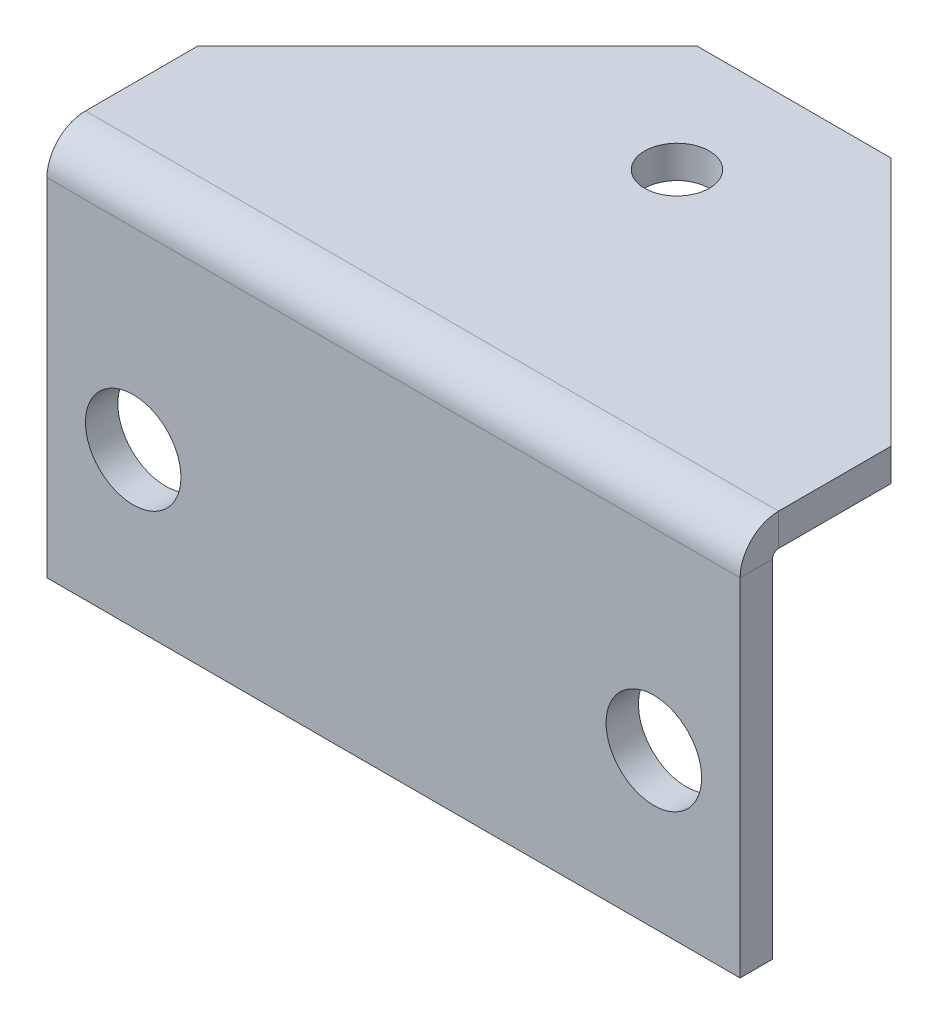
ISO-10303-21;
HEADER;
FILE_DESCRIPTION(('STEP AP214'),'2;1');
FILE_NAME('part.step','',(''),(''),'','','');
FILE_SCHEMA(('AUTOMOTIVE_DESIGN { 1 0 10303 214 1 1 1 1 }'));
ENDSEC;
DATA;
#1=APPLICATION_CONTEXT('core data for automotive mechanical design processes');
#2=APPLICATION_PROTOCOL_DEFINITION('international standard','automotive_design',2000,#1);
#3=PRODUCT_CONTEXT('',#1,'mechanical');
#4=PRODUCT('Part','Part','',(#3));
#5=PRODUCT_RELATED_PRODUCT_CATEGORY('part','',(#4));
#6=PRODUCT_DEFINITION_FORMATION('','',#4);
#7=PRODUCT_DEFINITION_CONTEXT('part definition',#1,'design');
#8=PRODUCT_DEFINITION('design','',#6,#7);
#9=PRODUCT_DEFINITION_SHAPE('','',#8);
#10=(LENGTH_UNIT() NAMED_UNIT(*) SI_UNIT(.MILLI.,.METRE.));
#11=(NAMED_UNIT(*) PLANE_ANGLE_UNIT() SI_UNIT($,.RADIAN.));
#12=(NAMED_UNIT(*) SI_UNIT($,.STERADIAN.) SOLID_ANGLE_UNIT());
#13=UNCERTAINTY_MEASURE_WITH_UNIT(LENGTH_MEASURE(1.E-05),#10,'distance_accuracy_value','');
#14=(GEOMETRIC_REPRESENTATION_CONTEXT(3) GLOBAL_UNCERTAINTY_ASSIGNED_CONTEXT((#13)) GLOBAL_UNIT_ASSIGNED_CONTEXT((#10,
#11,#12)) REPRESENTATION_CONTEXT('',''));
#15=CARTESIAN_POINT('',(0.,0.,0.));
#16=DIRECTION('',(0.,0.,1.));
#17=DIRECTION('',(1.,0.,0.));
#18=AXIS2_PLACEMENT_3D('',#15,#16,#17);
#19=CARTESIAN_POINT('',(28.575,15.875,-2.667));
#20=DIRECTION('',(1.,0.,0.));
#21=DIRECTION('',(0.,0.,-1.));
#22=AXIS2_PLACEMENT_3D('',#19,#20,#21);
#23=PLANE('',#22);
#24=DIRECTION('',(0.,1.,0.));
#25=VECTOR('',#24,1.);
#26=CARTESIAN_POINT('',(28.575,15.875,-2.667));
#27=LINE('',#26,#25);
#28=CARTESIAN_POINT('',(28.575,-15.875,-2.667));
#29=VERTEX_POINT('',#28);
#30=CARTESIAN_POINT('',(28.575,12.7,-2.667));
#31=VERTEX_POINT('',#30);
#32=EDGE_CURVE('E231',#29,#31,#27,.T.);
#33=ORIENTED_EDGE('',*,*,#32,.T.);
#34=DIRECTION('',(0.,0.,1.));
#35=VECTOR('',#34,1.);
#36=CARTESIAN_POINT('',(28.575,12.7,-2.667));
#37=LINE('',#36,#35);
#38=CARTESIAN_POINT('',(28.575,12.7,0.));
#39=VERTEX_POINT('',#38);
#40=EDGE_CURVE('E208',#31,#39,#37,.T.);
#41=ORIENTED_EDGE('',*,*,#40,.T.);
#42=DIRECTION('',(0.,1.,0.));
#43=VECTOR('',#42,1.);
#44=CARTESIAN_POINT('',(28.575,15.875,0.));
#45=LINE('',#44,#43);
#46=CARTESIAN_POINT('',(28.575,-15.875,0.));
#47=VERTEX_POINT('',#46);
#48=EDGE_CURVE('E227',#47,#39,#45,.T.);
#49=ORIENTED_EDGE('',*,*,#48,.F.);
#50=DIRECTION('',(0.,0.,1.));
#51=VECTOR('',#50,1.);
#52=CARTESIAN_POINT('',(28.575,-15.875,-2.667));
#53=LINE('',#52,#51);
#54=EDGE_CURVE('E253',#29,#47,#53,.T.);
#55=ORIENTED_EDGE('',*,*,#54,.F.);
#56=EDGE_LOOP('',(#33,#41,#49,#55));
#57=FACE_BOUND('',#56,.T.);
#58=ADVANCED_FACE('F66',(#57),#23,.T.);
#59=CARTESIAN_POINT('',(0.,0.,-2.667));
#60=DIRECTION('',(0.,0.,1.));
#61=DIRECTION('',(1.,0.,0.));
#62=AXIS2_PLACEMENT_3D('',#59,#60,#61);
#63=PLANE('',#62);
#64=CARTESIAN_POINT('',(-21.463,-3.175,-2.667));
#65=DIRECTION('',(0.,0.,1.));
#66=DIRECTION('',(1.,0.,0.));
#67=AXIS2_PLACEMENT_3D('',#64,#65,#66);
#68=CIRCLE('',#67,3.937);
#69=CARTESIAN_POINT('',(-17.526,-3.175,-2.667));
#70=VERTEX_POINT('',#69);
#71=EDGE_CURVE('E199',#70,#70,#68,.T.);
#72=ORIENTED_EDGE('',*,*,#71,.T.);
#73=EDGE_LOOP('',(#72));
#74=FACE_BOUND('',#73,.T.);
#75=CARTESIAN_POINT('',(21.463,-3.175,-2.667));
#76=DIRECTION('',(0.,0.,1.));
#77=DIRECTION('',(1.,0.,0.));
#78=AXIS2_PLACEMENT_3D('',#75,#76,#77);
#79=CIRCLE('',#78,3.937);
#80=CARTESIAN_POINT('',(25.4,-3.175,-2.667));
#81=VERTEX_POINT('',#80);
#82=EDGE_CURVE('E289',#81,#81,#79,.T.);
#83=ORIENTED_EDGE('',*,*,#82,.T.);
#84=EDGE_LOOP('',(#83));
#85=FACE_BOUND('',#84,.T.);
#86=DIRECTION('',(1.,0.,0.));
#87=VECTOR('',#86,1.);
#88=CARTESIAN_POINT('',(28.575,12.7,-2.667));
#89=LINE('',#88,#87);
#90=CARTESIAN_POINT('',(-28.575,12.7,-2.667));
#91=VERTEX_POINT('',#90);
#92=EDGE_CURVE('E216',#31,#91,#89,.F.);
#93=ORIENTED_EDGE('',*,*,#92,.F.);
#94=ORIENTED_EDGE('',*,*,#32,.F.);
#95=DIRECTION('',(1.,0.,0.));
#96=VECTOR('',#95,1.);
#97=CARTESIAN_POINT('',(-28.575,-15.875,-2.667));
#98=LINE('',#97,#96);
#99=CARTESIAN_POINT('',(-28.575,-15.875,-2.667));
#100=VERTEX_POINT('',#99);
#101=EDGE_CURVE('E239',#100,#29,#98,.T.);
#102=ORIENTED_EDGE('',*,*,#101,.F.);
#103=DIRECTION('',(0.,-1.,0.));
#104=VECTOR('',#103,1.);
#105=CARTESIAN_POINT('',(-28.575,15.875,-2.667));
#106=LINE('',#105,#104);
#107=EDGE_CURVE('E235',#91,#100,#106,.T.);
#108=ORIENTED_EDGE('',*,*,#107,.F.);
#109=EDGE_LOOP('',(#93,#94,#102,#108));
#110=FACE_BOUND('',#109,.T.);
#111=ADVANCED_FACE('F315',(#74,#85,#110),#63,.F.);
#112=CARTESIAN_POINT('',(0.,0.,0.));
#113=DIRECTION('',(0.,0.,1.));
#114=DIRECTION('',(1.,0.,0.));
#115=AXIS2_PLACEMENT_3D('',#112,#113,#114);
#116=PLANE('',#115);
#117=CARTESIAN_POINT('',(-21.463,-3.175,0.));
#118=DIRECTION('',(0.,0.,1.));
#119=DIRECTION('',(1.,0.,0.));
#120=AXIS2_PLACEMENT_3D('',#117,#118,#119);
#121=CIRCLE('',#120,3.937);
#122=CARTESIAN_POINT('',(-17.526,-3.175,0.));
#123=VERTEX_POINT('',#122);
#124=EDGE_CURVE('E285',#123,#123,#121,.T.);
#125=ORIENTED_EDGE('',*,*,#124,.F.);
#126=EDGE_LOOP('',(#125));
#127=FACE_BOUND('',#126,.T.);
#128=CARTESIAN_POINT('',(21.463,-3.175,0.));
#129=DIRECTION('',(0.,0.,1.));
#130=DIRECTION('',(1.,0.,0.));
#131=AXIS2_PLACEMENT_3D('',#128,#129,#130);
#132=CIRCLE('',#131,3.937);
#133=CARTESIAN_POINT('',(25.4,-3.175,0.));
#134=VERTEX_POINT('',#133);
#135=EDGE_CURVE('E280',#134,#134,#132,.T.);
#136=ORIENTED_EDGE('',*,*,#135,.F.);
#137=EDGE_LOOP('',(#136));
#138=FACE_BOUND('',#137,.T.);
#139=ORIENTED_EDGE('',*,*,#48,.T.);
#140=DIRECTION('',(1.,0.,0.));
#141=VECTOR('',#140,1.);
#142=CARTESIAN_POINT('',(28.575,12.7,0.));
#143=LINE('',#142,#141);
#144=CARTESIAN_POINT('',(-28.575,12.7,0.));
#145=VERTEX_POINT('',#144);
#146=EDGE_CURVE('E200',#39,#145,#143,.F.);
#147=ORIENTED_EDGE('',*,*,#146,.T.);
#148=DIRECTION('',(0.,-1.,0.));
#149=VECTOR('',#148,1.);
#150=CARTESIAN_POINT('',(-28.575,15.875,0.));
#151=LINE('',#150,#149);
#152=CARTESIAN_POINT('',(-28.575,-15.875,0.));
#153=VERTEX_POINT('',#152);
#154=EDGE_CURVE('E247',#145,#153,#151,.T.);
#155=ORIENTED_EDGE('',*,*,#154,.T.);
#156=DIRECTION('',(1.,0.,0.));
#157=VECTOR('',#156,1.);
#158=CARTESIAN_POINT('',(-28.575,-15.875,0.));
#159=LINE('',#158,#157);
#160=EDGE_CURVE('E236',#153,#47,#159,.T.);
#161=ORIENTED_EDGE('',*,*,#160,.T.);
#162=EDGE_LOOP('',(#139,#147,#155,#161));
#163=FACE_BOUND('',#162,.T.);
#164=ADVANCED_FACE('F330',(#127,#138,#163),#116,.T.);
#165=CARTESIAN_POINT('',(-28.575,-15.875,-2.667));
#166=DIRECTION('',(0.,-1.,0.));
#167=DIRECTION('',(0.,0.,-1.));
#168=AXIS2_PLACEMENT_3D('',#165,#166,#167);
#169=PLANE('',#168);
#170=ORIENTED_EDGE('',*,*,#160,.F.);
#171=DIRECTION('',(0.,0.,1.));
#172=VECTOR('',#171,1.);
#173=CARTESIAN_POINT('',(-28.575,-15.875,-2.667));
#174=LINE('',#173,#172);
#175=EDGE_CURVE('E243',#100,#153,#174,.T.);
#176=ORIENTED_EDGE('',*,*,#175,.F.);
#177=ORIENTED_EDGE('',*,*,#101,.T.);
#178=ORIENTED_EDGE('',*,*,#54,.T.);
#179=EDGE_LOOP('',(#170,#176,#177,#178));
#180=FACE_BOUND('',#179,.T.);
#181=ADVANCED_FACE('F321',(#180),#169,.T.);
#182=CARTESIAN_POINT('',(-28.575,15.875,-2.667));
#183=DIRECTION('',(-1.,0.,0.));
#184=DIRECTION('',(0.,0.,1.));
#185=AXIS2_PLACEMENT_3D('',#182,#183,#184);
#186=PLANE('',#185);
#187=DIRECTION('',(0.,0.,1.));
#188=VECTOR('',#187,1.);
#189=CARTESIAN_POINT('',(-28.575,12.7,-2.667));
#190=LINE('',#189,#188);
#191=EDGE_CURVE('E223',#91,#145,#190,.T.);
#192=ORIENTED_EDGE('',*,*,#191,.F.);
#193=ORIENTED_EDGE('',*,*,#107,.T.);
#194=ORIENTED_EDGE('',*,*,#175,.T.);
#195=ORIENTED_EDGE('',*,*,#154,.F.);
#196=EDGE_LOOP('',(#192,#193,#194,#195));
#197=FACE_BOUND('',#196,.T.);
#198=ADVANCED_FACE('F326',(#197),#186,.T.);
#199=CARTESIAN_POINT('',(-28.575,12.7,-3.175));
#200=DIRECTION('',(-1.,0.,0.));
#201=DIRECTION('',(0.,0.,1.));
#202=AXIS2_PLACEMENT_3D('',#199,#200,#201);
#203=PLANE('',#202);
#204=DIRECTION('',(0.,1.,0.));
#205=VECTOR('',#204,1.);
#206=CARTESIAN_POINT('',(-28.575,15.875,-3.17499999999999));
#207=LINE('',#206,#205);
#208=CARTESIAN_POINT('',(-28.575,13.208,-3.175));
#209=VERTEX_POINT('',#208);
#210=CARTESIAN_POINT('',(-28.575,15.875,-3.17499999999999));
#211=VERTEX_POINT('',#210);
#212=EDGE_CURVE('E166',#209,#211,#207,.T.);
#213=ORIENTED_EDGE('',*,*,#212,.F.);
#214=CARTESIAN_POINT('',(-28.575,12.7,-3.175));
#215=DIRECTION('',(1.,0.,0.));
#216=DIRECTION('',(0.,0.,-1.));
#217=AXIS2_PLACEMENT_3D('',#214,#215,#216);
#218=CIRCLE('',#217,0.508);
#219=EDGE_CURVE('E212',#91,#209,#218,.F.);
#220=ORIENTED_EDGE('',*,*,#219,.F.);
#221=ORIENTED_EDGE('',*,*,#191,.T.);
#222=CARTESIAN_POINT('',(-28.575,12.7,-3.175));
#223=DIRECTION('',(1.,0.,0.));
#224=DIRECTION('',(0.,0.,-1.));
#225=AXIS2_PLACEMENT_3D('',#222,#223,#224);
#226=CIRCLE('',#225,3.175);
#227=EDGE_CURVE('E203',#145,#211,#226,.F.);
#228=ORIENTED_EDGE('',*,*,#227,.T.);
#229=EDGE_LOOP('',(#213,#220,#221,#228));
#230=FACE_BOUND('',#229,.T.);
#231=ADVANCED_FACE('F328',(#230),#203,.T.);
#232=CARTESIAN_POINT('',(28.575,12.7,-3.175));
#233=DIRECTION('',(-1.,0.,0.));
#234=DIRECTION('',(0.,0.,1.));
#235=AXIS2_PLACEMENT_3D('',#232,#233,#234);
#236=PLANE('',#235);
#237=CARTESIAN_POINT('',(28.575,12.7,-3.175));
#238=DIRECTION('',(1.,0.,0.));
#239=DIRECTION('',(0.,0.,-1.));
#240=AXIS2_PLACEMENT_3D('',#237,#238,#239);
#241=CIRCLE('',#240,0.508);
#242=CARTESIAN_POINT('',(28.575,13.208,-3.175));
#243=VERTEX_POINT('',#242);
#244=EDGE_CURVE('E219',#243,#31,#241,.T.);
#245=ORIENTED_EDGE('',*,*,#244,.F.);
#246=DIRECTION('',(0.,1.,0.));
#247=VECTOR('',#246,1.);
#248=CARTESIAN_POINT('',(28.575,13.208,-3.175));
#249=LINE('',#248,#247);
#250=CARTESIAN_POINT('',(28.575,15.875,-3.17499999999999));
#251=VERTEX_POINT('',#250);
#252=EDGE_CURVE('E190',#243,#251,#249,.T.);
#253=ORIENTED_EDGE('',*,*,#252,.T.);
#254=CARTESIAN_POINT('',(28.575,12.7,-3.175));
#255=DIRECTION('',(1.,0.,0.));
#256=DIRECTION('',(0.,0.,-1.));
#257=AXIS2_PLACEMENT_3D('',#254,#255,#256);
#258=CIRCLE('',#257,3.175);
#259=EDGE_CURVE('E204',#251,#39,#258,.T.);
#260=ORIENTED_EDGE('',*,*,#259,.T.);
#261=ORIENTED_EDGE('',*,*,#40,.F.);
#262=EDGE_LOOP('',(#245,#253,#260,#261));
#263=FACE_BOUND('',#262,.T.);
#264=ADVANCED_FACE('F307',(#263),#236,.F.);
#265=CARTESIAN_POINT('',(28.575,12.7,-3.175));
#266=DIRECTION('',(1.,0.,0.));
#267=DIRECTION('',(0.,1.,0.));
#268=AXIS2_PLACEMENT_3D('',#265,#266,#267);
#269=CYLINDRICAL_SURFACE('',#268,3.175);
#270=ORIENTED_EDGE('',*,*,#146,.F.);
#271=ORIENTED_EDGE('',*,*,#259,.F.);
#272=DIRECTION('',(1.,0.,0.));
#273=VECTOR('',#272,1.);
#274=CARTESIAN_POINT('',(0.,15.875,-3.17499999999999));
#275=LINE('',#274,#273);
#276=EDGE_CURVE('E187',#211,#251,#275,.T.);
#277=ORIENTED_EDGE('',*,*,#276,.F.);
#278=ORIENTED_EDGE('',*,*,#227,.F.);
#279=EDGE_LOOP('',(#270,#271,#277,#278));
#280=FACE_BOUND('',#279,.T.);
#281=ADVANCED_FACE('F304',(#280),#269,.T.);
#282=CARTESIAN_POINT('',(28.575,12.7,-3.175));
#283=DIRECTION('',(1.,0.,0.));
#284=DIRECTION('',(0.,1.,0.));
#285=AXIS2_PLACEMENT_3D('',#282,#283,#284);
#286=CYLINDRICAL_SURFACE('',#285,0.508);
#287=ORIENTED_EDGE('',*,*,#92,.T.);
#288=ORIENTED_EDGE('',*,*,#219,.T.);
#289=DIRECTION('',(-1.,0.,0.));
#290=VECTOR('',#289,1.);
#291=CARTESIAN_POINT('',(-28.575,13.208,-3.175));
#292=LINE('',#291,#290);
#293=EDGE_CURVE('E194',#209,#243,#292,.F.);
#294=ORIENTED_EDGE('',*,*,#293,.T.);
#295=ORIENTED_EDGE('',*,*,#244,.T.);
#296=EDGE_LOOP('',(#287,#288,#294,#295));
#297=FACE_BOUND('',#296,.T.);
#298=ADVANCED_FACE('F310',(#297),#286,.F.);
#299=CARTESIAN_POINT('',(28.575,15.875,-2.66699999999999));
#300=DIRECTION('',(1.,0.,0.));
#301=DIRECTION('',(0.,0.,-1.));
#302=AXIS2_PLACEMENT_3D('',#299,#300,#301);
#303=PLANE('',#302);
#304=DIRECTION('',(0.,1.,0.));
#305=VECTOR('',#304,1.);
#306=CARTESIAN_POINT('',(28.575,10.287,-12.446));
#307=LINE('',#306,#305);
#308=CARTESIAN_POINT('',(28.575,13.2080000000001,-12.446));
#309=VERTEX_POINT('',#308);
#310=CARTESIAN_POINT('',(28.575,15.875,-12.446));
#311=VERTEX_POINT('',#310);
#312=EDGE_CURVE('E267',#309,#311,#307,.T.);
#313=ORIENTED_EDGE('',*,*,#312,.T.);
#314=DIRECTION('',(0.,0.,1.));
#315=VECTOR('',#314,1.);
#316=CARTESIAN_POINT('',(28.575,15.875,-2.66699999999999));
#317=LINE('',#316,#315);
#318=EDGE_CURVE('E174',#311,#251,#317,.T.);
#319=ORIENTED_EDGE('',*,*,#318,.T.);
#320=ORIENTED_EDGE('',*,*,#252,.F.);
#321=DIRECTION('',(0.,0.,-1.));
#322=VECTOR('',#321,1.);
#323=CARTESIAN_POINT('',(28.575,13.208,0.));
#324=LINE('',#323,#322);
#325=EDGE_CURVE('E168',#309,#243,#324,.F.);
#326=ORIENTED_EDGE('',*,*,#325,.F.);
#327=EDGE_LOOP('',(#313,#319,#320,#326));
#328=FACE_BOUND('',#327,.T.);
#329=ADVANCED_FACE('F301',(#328),#303,.T.);
#330=CARTESIAN_POINT('',(-28.575,15.8750000000001,-33.02));
#331=DIRECTION('',(-1.,0.,0.));
#332=DIRECTION('',(0.,0.,1.));
#333=AXIS2_PLACEMENT_3D('',#330,#331,#332);
#334=PLANE('',#333);
#335=DIRECTION('',(0.,1.,0.));
#336=VECTOR('',#335,1.);
#337=CARTESIAN_POINT('',(-28.575,10.287,-12.446));
#338=LINE('',#337,#336);
#339=CARTESIAN_POINT('',(-28.575,13.2080000000001,-12.446));
#340=VERTEX_POINT('',#339);
#341=CARTESIAN_POINT('',(-28.575,15.875,-12.446));
#342=VERTEX_POINT('',#341);
#343=EDGE_CURVE('E141',#340,#342,#338,.T.);
#344=ORIENTED_EDGE('',*,*,#343,.F.);
#345=DIRECTION('',(0.,0.,1.));
#346=VECTOR('',#345,1.);
#347=CARTESIAN_POINT('',(-28.575,13.208,0.));
#348=LINE('',#347,#346);
#349=EDGE_CURVE('E184',#209,#340,#348,.F.);
#350=ORIENTED_EDGE('',*,*,#349,.F.);
#351=ORIENTED_EDGE('',*,*,#212,.T.);
#352=DIRECTION('',(0.,0.,-1.));
#353=VECTOR('',#352,1.);
#354=CARTESIAN_POINT('',(-28.575,15.8750000000001,-33.02));
#355=LINE('',#354,#353);
#356=EDGE_CURVE('E157',#211,#342,#355,.T.);
#357=ORIENTED_EDGE('',*,*,#356,.T.);
#358=EDGE_LOOP('',(#344,#350,#351,#357));
#359=FACE_BOUND('',#358,.T.);
#360=ADVANCED_FACE('F165',(#359),#334,.T.);
#361=CARTESIAN_POINT('',(0.,15.875,0.));
#362=DIRECTION('',(0.,1.,0.));
#363=DIRECTION('',(0.,0.,1.));
#364=AXIS2_PLACEMENT_3D('',#361,#362,#363);
#365=PLANE('',#364);
#366=DIRECTION('',(0.707106781186547,0.,-0.707106781186548));
#367=VECTOR('',#366,1.);
#368=CARTESIAN_POINT('',(-28.575,15.875,-12.446));
#369=LINE('',#368,#367);
#370=CARTESIAN_POINT('',(-8.001,15.8750000000001,-33.02));
#371=VERTEX_POINT('',#370);
#372=EDGE_CURVE('E81',#342,#371,#369,.T.);
#373=ORIENTED_EDGE('',*,*,#372,.F.);
#374=ORIENTED_EDGE('',*,*,#356,.F.);
#375=ORIENTED_EDGE('',*,*,#276,.T.);
#376=ORIENTED_EDGE('',*,*,#318,.F.);
#377=DIRECTION('',(0.707106781186548,0.,0.707106781186548));
#378=VECTOR('',#377,1.);
#379=CARTESIAN_POINT('',(8.001,15.8750000000001,-33.02));
#380=LINE('',#379,#378);
#381=CARTESIAN_POINT('',(8.001,15.8750000000001,-33.02));
#382=VERTEX_POINT('',#381);
#383=EDGE_CURVE('E162',#382,#311,#380,.T.);
#384=ORIENTED_EDGE('',*,*,#383,.F.);
#385=DIRECTION('',(1.,0.,0.));
#386=VECTOR('',#385,1.);
#387=CARTESIAN_POINT('',(28.575,15.8750000000001,-33.02));
#388=LINE('',#387,#386);
#389=EDGE_CURVE('E160',#371,#382,#388,.T.);
#390=ORIENTED_EDGE('',*,*,#389,.F.);
#391=EDGE_LOOP('',(#373,#374,#375,#376,#384,#390));
#392=FACE_BOUND('',#391,.T.);
#393=CARTESIAN_POINT('',(0.,15.8750000000001,-23.368));
#394=DIRECTION('',(0.,1.,0.));
#395=DIRECTION('',(0.,0.,1.));
#396=AXIS2_PLACEMENT_3D('',#393,#394,#395);
#397=CIRCLE('',#396,2.667);
#398=CARTESIAN_POINT('',(0.,15.8750000000001,-20.701));
#399=VERTEX_POINT('',#398);
#400=EDGE_CURVE('E552',#399,#399,#397,.T.);
#401=ORIENTED_EDGE('',*,*,#400,.F.);
#402=EDGE_LOOP('',(#401));
#403=FACE_BOUND('',#402,.T.);
#404=ADVANCED_FACE('F154',(#392,#403),#365,.T.);
#405=CARTESIAN_POINT('',(0.,13.208,0.));
#406=DIRECTION('',(0.,1.,0.));
#407=DIRECTION('',(0.,0.,1.));
#408=AXIS2_PLACEMENT_3D('',#405,#406,#407);
#409=PLANE('',#408);
#410=CARTESIAN_POINT('',(0.,13.2080000000001,-23.368));
#411=DIRECTION('',(0.,1.,0.));
#412=DIRECTION('',(0.,0.,1.));
#413=AXIS2_PLACEMENT_3D('',#410,#411,#412);
#414=CIRCLE('',#413,2.667);
#415=CARTESIAN_POINT('',(0.,13.2080000000001,-20.701));
#416=VERTEX_POINT('',#415);
#417=EDGE_CURVE('E69',#416,#416,#414,.T.);
#418=ORIENTED_EDGE('',*,*,#417,.T.);
#419=EDGE_LOOP('',(#418));
#420=FACE_BOUND('',#419,.T.);
#421=ORIENTED_EDGE('',*,*,#349,.T.);
#422=DIRECTION('',(0.707106781186547,0.,-0.707106781186548));
#423=VECTOR('',#422,1.);
#424=CARTESIAN_POINT('',(-20.5105,13.2080000000001,-20.5105));
#425=LINE('',#424,#423);
#426=CARTESIAN_POINT('',(-8.001,13.2080000000001,-33.02));
#427=VERTEX_POINT('',#426);
#428=EDGE_CURVE('E144',#340,#427,#425,.T.);
#429=ORIENTED_EDGE('',*,*,#428,.T.);
#430=DIRECTION('',(-1.,0.,0.));
#431=VECTOR('',#430,1.);
#432=CARTESIAN_POINT('',(0.,13.2080000000001,-33.02));
#433=LINE('',#432,#431);
#434=CARTESIAN_POINT('',(8.001,13.2080000000001,-33.02));
#435=VERTEX_POINT('',#434);
#436=EDGE_CURVE('E177',#427,#435,#433,.F.);
#437=ORIENTED_EDGE('',*,*,#436,.T.);
#438=DIRECTION('',(0.707106781186548,0.,0.707106781186548));
#439=VECTOR('',#438,1.);
#440=CARTESIAN_POINT('',(20.5105,13.2080000000001,-20.5105));
#441=LINE('',#440,#439);
#442=EDGE_CURVE('E89',#435,#309,#441,.T.);
#443=ORIENTED_EDGE('',*,*,#442,.T.);
#444=ORIENTED_EDGE('',*,*,#325,.T.);
#445=ORIENTED_EDGE('',*,*,#293,.F.);
#446=EDGE_LOOP('',(#421,#429,#437,#443,#444,#445));
#447=FACE_BOUND('',#446,.T.);
#448=ADVANCED_FACE('F271',(#420,#447),#409,.F.);
#449=CARTESIAN_POINT('',(28.575,15.8750000000001,-33.02));
#450=DIRECTION('',(0.,0.,-1.));
#451=DIRECTION('',(0.,1.,0.));
#452=AXIS2_PLACEMENT_3D('',#449,#450,#451);
#453=PLANE('',#452);
#454=DIRECTION('',(0.,-1.,0.));
#455=VECTOR('',#454,1.);
#456=CARTESIAN_POINT('',(-8.001,15.8750000000001,-33.02));
#457=LINE('',#456,#455);
#458=EDGE_CURVE('E13',#371,#427,#457,.T.);
#459=ORIENTED_EDGE('',*,*,#458,.F.);
#460=ORIENTED_EDGE('',*,*,#389,.T.);
#461=DIRECTION('',(0.,1.,0.));
#462=VECTOR('',#461,1.);
#463=CARTESIAN_POINT('',(8.001,15.8750000000001,-33.02));
#464=LINE('',#463,#462);
#465=EDGE_CURVE('E75',#435,#382,#464,.T.);
#466=ORIENTED_EDGE('',*,*,#465,.F.);
#467=ORIENTED_EDGE('',*,*,#436,.F.);
#468=EDGE_LOOP('',(#459,#460,#466,#467));
#469=FACE_BOUND('',#468,.T.);
#470=ADVANCED_FACE('F269',(#469),#453,.T.);
#471=CARTESIAN_POINT('',(21.463,-3.175,-5.588));
#472=DIRECTION('',(0.,0.,1.));
#473=DIRECTION('',(1.,0.,0.));
#474=AXIS2_PLACEMENT_3D('',#471,#472,#473);
#475=CYLINDRICAL_SURFACE('',#474,3.937);
#476=ORIENTED_EDGE('',*,*,#135,.T.);
#477=EDGE_LOOP('',(#476));
#478=FACE_BOUND('',#477,.T.);
#479=ORIENTED_EDGE('',*,*,#82,.F.);
#480=EDGE_LOOP('',(#479));
#481=FACE_BOUND('',#480,.T.);
#482=ADVANCED_FACE('F364',(#478,#481),#475,.F.);
#483=CARTESIAN_POINT('',(-21.463,-3.175,-5.588));
#484=DIRECTION('',(0.,0.,1.));
#485=DIRECTION('',(1.,0.,0.));
#486=AXIS2_PLACEMENT_3D('',#483,#484,#485);
#487=CYLINDRICAL_SURFACE('',#486,3.937);
#488=ORIENTED_EDGE('',*,*,#124,.T.);
#489=EDGE_LOOP('',(#488));
#490=FACE_BOUND('',#489,.T.);
#491=ORIENTED_EDGE('',*,*,#71,.F.);
#492=EDGE_LOOP('',(#491));
#493=FACE_BOUND('',#492,.T.);
#494=ADVANCED_FACE('F369',(#490,#493),#487,.F.);
#495=CARTESIAN_POINT('',(8.001,10.2870000000001,-33.02));
#496=DIRECTION('',(-0.707106781186548,0.,0.707106781186548));
#497=DIRECTION('',(0.707106781186548,0.,0.707106781186548));
#498=AXIS2_PLACEMENT_3D('',#495,#496,#497);
#499=PLANE('',#498);
#500=ORIENTED_EDGE('',*,*,#465,.T.);
#501=ORIENTED_EDGE('',*,*,#383,.T.);
#502=ORIENTED_EDGE('',*,*,#312,.F.);
#503=ORIENTED_EDGE('',*,*,#442,.F.);
#504=EDGE_LOOP('',(#500,#501,#502,#503));
#505=FACE_BOUND('',#504,.T.);
#506=ADVANCED_FACE('F261',(#505),#499,.F.);
#507=CARTESIAN_POINT('',(-28.575,10.287,-12.446));
#508=DIRECTION('',(0.707106781186548,0.,0.707106781186548));
#509=DIRECTION('',(0.707106781186547,0.,-0.707106781186548));
#510=AXIS2_PLACEMENT_3D('',#507,#508,#509);
#511=PLANE('',#510);
#512=ORIENTED_EDGE('',*,*,#343,.T.);
#513=ORIENTED_EDGE('',*,*,#372,.T.);
#514=ORIENTED_EDGE('',*,*,#458,.T.);
#515=ORIENTED_EDGE('',*,*,#428,.F.);
#516=EDGE_LOOP('',(#512,#513,#514,#515));
#517=FACE_BOUND('',#516,.T.);
#518=ADVANCED_FACE('F142',(#517),#511,.F.);
#519=CARTESIAN_POINT('',(0.,10.2870000000001,-23.368));
#520=DIRECTION('',(0.,1.,0.));
#521=DIRECTION('',(0.,0.,1.));
#522=AXIS2_PLACEMENT_3D('',#519,#520,#521);
#523=CYLINDRICAL_SURFACE('',#522,2.667);
#524=ORIENTED_EDGE('',*,*,#400,.T.);
#525=EDGE_LOOP('',(#524));
#526=FACE_BOUND('',#525,.T.);
#527=ORIENTED_EDGE('',*,*,#417,.F.);
#528=EDGE_LOOP('',(#527));
#529=FACE_BOUND('',#528,.T.);
#530=ADVANCED_FACE('F437',(#526,#529),#523,.F.);
#531=CLOSED_SHELL('',(#58,#111,#164,#181,#198,#231,#264,#281,#298,#329,#360,#404,#448,#470,#482,
#494,#506,#518,#530));
#532=MANIFOLD_SOLID_BREP('B2',#531);
#533=ADVANCED_BREP_SHAPE_REPRESENTATION('',(#18,#532),#14);
#534=SHAPE_DEFINITION_REPRESENTATION(#9,#533);
ENDSEC;
END-ISO-10303-21;
